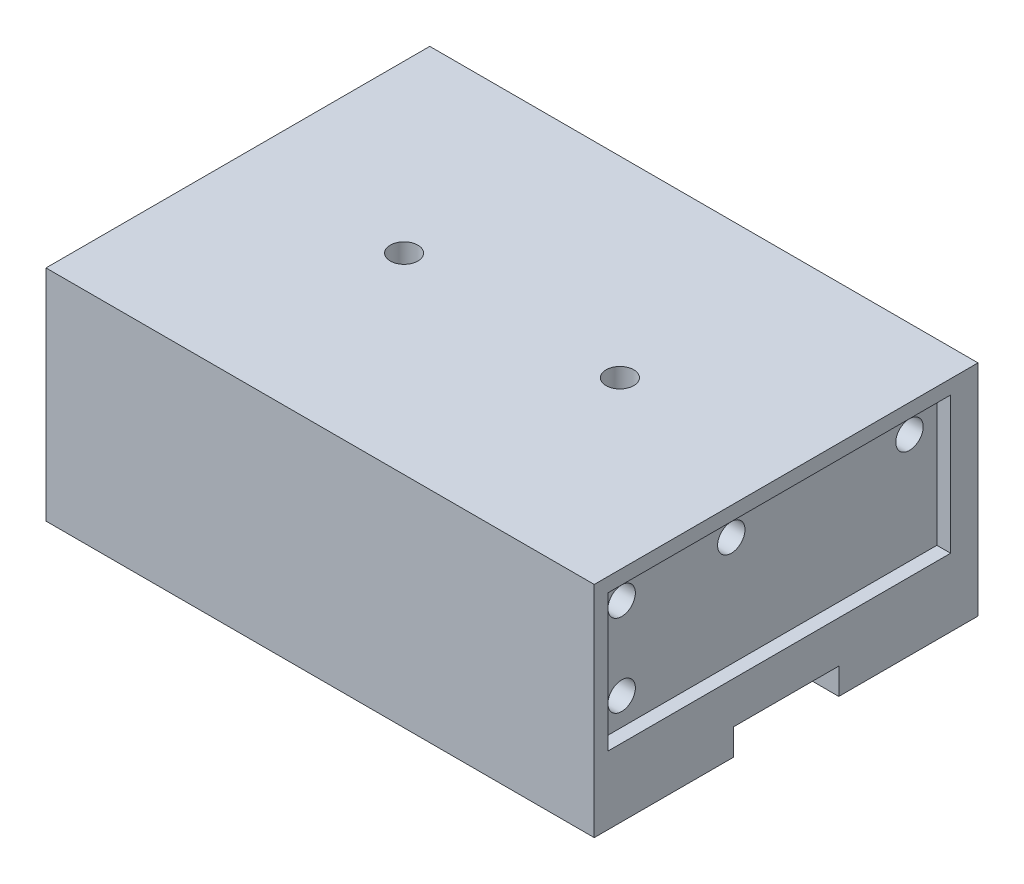
ISO-10303-21;
HEADER;
FILE_DESCRIPTION(('STEP AP214'),'2;1');
FILE_NAME('part.step','',(''),(''),'','','');
FILE_SCHEMA(('AUTOMOTIVE_DESIGN { 1 0 10303 214 1 1 1 1 }'));
ENDSEC;
DATA;
#1=APPLICATION_CONTEXT('core data for automotive mechanical design processes');
#2=APPLICATION_PROTOCOL_DEFINITION('international standard','automotive_design',2000,#1);
#3=PRODUCT_CONTEXT('',#1,'mechanical');
#4=PRODUCT('Part','Part','',(#3));
#5=PRODUCT_RELATED_PRODUCT_CATEGORY('part','',(#4));
#6=PRODUCT_DEFINITION_FORMATION('','',#4);
#7=PRODUCT_DEFINITION_CONTEXT('part definition',#1,'design');
#8=PRODUCT_DEFINITION('design','',#6,#7);
#9=PRODUCT_DEFINITION_SHAPE('','',#8);
#10=(LENGTH_UNIT() NAMED_UNIT(*) SI_UNIT(.MILLI.,.METRE.));
#11=(NAMED_UNIT(*) PLANE_ANGLE_UNIT() SI_UNIT($,.RADIAN.));
#12=(NAMED_UNIT(*) SI_UNIT($,.STERADIAN.) SOLID_ANGLE_UNIT());
#13=UNCERTAINTY_MEASURE_WITH_UNIT(LENGTH_MEASURE(1.E-05),#10,'distance_accuracy_value','');
#14=(GEOMETRIC_REPRESENTATION_CONTEXT(3) GLOBAL_UNCERTAINTY_ASSIGNED_CONTEXT((#13)) GLOBAL_UNIT_ASSIGNED_CONTEXT((#10,
#11,#12)) REPRESENTATION_CONTEXT('',''));
#15=CARTESIAN_POINT('',(0.,0.,0.));
#16=DIRECTION('',(0.,0.,1.));
#17=DIRECTION('',(1.,0.,0.));
#18=AXIS2_PLACEMENT_3D('',#15,#16,#17);
#19=CARTESIAN_POINT('',(0.,0.,0.));
#20=DIRECTION('',(0.,-1.,0.));
#21=DIRECTION('',(0.,0.,-1.));
#22=AXIS2_PLACEMENT_3D('',#19,#20,#21);
#23=PLANE('',#22);
#24=DIRECTION('',(-1.,0.,0.));
#25=VECTOR('',#24,1.);
#26=CARTESIAN_POINT('',(-31.75,0.,6.1));
#27=LINE('',#26,#25);
#28=CARTESIAN_POINT('',(31.75,0.,6.1));
#29=VERTEX_POINT('',#28);
#30=CARTESIAN_POINT('',(-31.75,0.,6.1));
#31=VERTEX_POINT('',#30);
#32=EDGE_CURVE('E229',#29,#31,#27,.T.);
#33=ORIENTED_EDGE('',*,*,#32,.F.);
#34=DIRECTION('',(0.,0.,-1.));
#35=VECTOR('',#34,1.);
#36=CARTESIAN_POINT('',(31.75,0.,22.225));
#37=LINE('',#36,#35);
#38=CARTESIAN_POINT('',(31.75,0.,22.225));
#39=VERTEX_POINT('',#38);
#40=EDGE_CURVE('E275',#39,#29,#37,.T.);
#41=ORIENTED_EDGE('',*,*,#40,.F.);
#42=DIRECTION('',(1.,0.,0.));
#43=VECTOR('',#42,1.);
#44=CARTESIAN_POINT('',(-31.75,0.,22.225));
#45=LINE('',#44,#43);
#46=CARTESIAN_POINT('',(-31.75,0.,22.225));
#47=VERTEX_POINT('',#46);
#48=EDGE_CURVE('E265',#47,#39,#45,.T.);
#49=ORIENTED_EDGE('',*,*,#48,.F.);
#50=DIRECTION('',(0.,0.,1.));
#51=VECTOR('',#50,1.);
#52=CARTESIAN_POINT('',(-31.75,0.,22.225));
#53=LINE('',#52,#51);
#54=EDGE_CURVE('E282',#31,#47,#53,.T.);
#55=ORIENTED_EDGE('',*,*,#54,.F.);
#56=EDGE_LOOP('',(#33,#41,#49,#55));
#57=FACE_BOUND('',#56,.T.);
#58=ADVANCED_FACE('F44',(#57),#23,.T.);
#59=CARTESIAN_POINT('',(31.75,25.4,22.225));
#60=DIRECTION('',(-1.,0.,0.));
#61=DIRECTION('',(0.,0.,1.));
#62=AXIS2_PLACEMENT_3D('',#59,#60,#61);
#63=PLANE('',#62);
#64=DIRECTION('',(0.,0.,-1.));
#65=VECTOR('',#64,1.);
#66=CARTESIAN_POINT('',(31.75,7.89096200252952,20.6375));
#67=LINE('',#66,#65);
#68=CARTESIAN_POINT('',(31.75,7.89096200252952,20.6375));
#69=VERTEX_POINT('',#68);
#70=CARTESIAN_POINT('',(31.75,7.89096200252952,-19.05));
#71=VERTEX_POINT('',#70);
#72=EDGE_CURVE('E173',#69,#71,#67,.T.);
#73=ORIENTED_EDGE('',*,*,#72,.F.);
#74=DIRECTION('',(0.,-1.,0.));
#75=VECTOR('',#74,1.);
#76=CARTESIAN_POINT('',(31.75,23.7659620025295,20.6375));
#77=LINE('',#76,#75);
#78=CARTESIAN_POINT('',(31.75,23.7659620025295,20.6375));
#79=VERTEX_POINT('',#78);
#80=EDGE_CURVE('E62',#79,#69,#77,.T.);
#81=ORIENTED_EDGE('',*,*,#80,.F.);
#82=DIRECTION('',(0.,0.,1.));
#83=VECTOR('',#82,1.);
#84=CARTESIAN_POINT('',(31.75,23.7659620025295,20.6375));
#85=LINE('',#84,#83);
#86=CARTESIAN_POINT('',(31.75,23.7659620025295,-19.05));
#87=VERTEX_POINT('',#86);
#88=EDGE_CURVE('E160',#87,#79,#85,.T.);
#89=ORIENTED_EDGE('',*,*,#88,.F.);
#90=DIRECTION('',(0.,1.,0.));
#91=VECTOR('',#90,1.);
#92=CARTESIAN_POINT('',(31.75,23.7659620025295,-19.05));
#93=LINE('',#92,#91);
#94=EDGE_CURVE('E164',#71,#87,#93,.T.);
#95=ORIENTED_EDGE('',*,*,#94,.F.);
#96=EDGE_LOOP('',(#73,#81,#89,#95));
#97=FACE_BOUND('',#96,.T.);
#98=ORIENTED_EDGE('',*,*,#40,.T.);
#99=DIRECTION('',(0.,-1.,0.));
#100=VECTOR('',#99,1.);
#101=CARTESIAN_POINT('',(31.75,3.048,6.1));
#102=LINE('',#101,#100);
#103=CARTESIAN_POINT('',(31.75,3.048,6.1));
#104=VERTEX_POINT('',#103);
#105=EDGE_CURVE('E251',#104,#29,#102,.T.);
#106=ORIENTED_EDGE('',*,*,#105,.F.);
#107=DIRECTION('',(0.,0.,1.));
#108=VECTOR('',#107,1.);
#109=CARTESIAN_POINT('',(31.75,3.048,6.1));
#110=LINE('',#109,#108);
#111=CARTESIAN_POINT('',(31.75,3.048,-6.1));
#112=VERTEX_POINT('',#111);
#113=EDGE_CURVE('E233',#112,#104,#110,.T.);
#114=ORIENTED_EDGE('',*,*,#113,.F.);
#115=DIRECTION('',(0.,-1.,0.));
#116=VECTOR('',#115,1.);
#117=CARTESIAN_POINT('',(31.75,3.048,-6.1));
#118=LINE('',#117,#116);
#119=CARTESIAN_POINT('',(31.75,0.,-6.1));
#120=VERTEX_POINT('',#119);
#121=EDGE_CURVE('E254',#112,#120,#118,.T.);
#122=ORIENTED_EDGE('',*,*,#121,.T.);
#123=CARTESIAN_POINT('',(31.75,0.,-22.225));
#124=VERTEX_POINT('',#123);
#125=EDGE_CURVE('E250',#120,#124,#37,.T.);
#126=ORIENTED_EDGE('',*,*,#125,.T.);
#127=DIRECTION('',(0.,-1.,0.));
#128=VECTOR('',#127,1.);
#129=CARTESIAN_POINT('',(31.75,25.4,-22.225));
#130=LINE('',#129,#128);
#131=CARTESIAN_POINT('',(31.75,25.4,-22.225));
#132=VERTEX_POINT('',#131);
#133=EDGE_CURVE('E11',#132,#124,#130,.T.);
#134=ORIENTED_EDGE('',*,*,#133,.F.);
#135=DIRECTION('',(0.,0.,-1.));
#136=VECTOR('',#135,1.);
#137=CARTESIAN_POINT('',(31.75,25.4,22.225));
#138=LINE('',#137,#136);
#139=CARTESIAN_POINT('',(31.75,25.4,22.225));
#140=VERTEX_POINT('',#139);
#141=EDGE_CURVE('E260',#140,#132,#138,.T.);
#142=ORIENTED_EDGE('',*,*,#141,.F.);
#143=DIRECTION('',(0.,-1.,0.));
#144=VECTOR('',#143,1.);
#145=CARTESIAN_POINT('',(31.75,25.4,22.225));
#146=LINE('',#145,#144);
#147=EDGE_CURVE('E274',#140,#39,#146,.T.);
#148=ORIENTED_EDGE('',*,*,#147,.T.);
#149=EDGE_LOOP('',(#98,#106,#114,#122,#126,#134,#142,#148));
#150=FACE_BOUND('',#149,.T.);
#151=ADVANCED_FACE('F46',(#97,#150),#63,.F.);
#152=CARTESIAN_POINT('',(-31.75,25.4,-22.225));
#153=DIRECTION('',(0.,0.,1.));
#154=DIRECTION('',(1.,0.,0.));
#155=AXIS2_PLACEMENT_3D('',#152,#153,#154);
#156=PLANE('',#155);
#157=DIRECTION('',(-1.,0.,0.));
#158=VECTOR('',#157,1.);
#159=CARTESIAN_POINT('',(-31.75,0.,-22.225));
#160=LINE('',#159,#158);
#161=CARTESIAN_POINT('',(-31.75,0.,-22.225));
#162=VERTEX_POINT('',#161);
#163=EDGE_CURVE('E279',#124,#162,#160,.T.);
#164=ORIENTED_EDGE('',*,*,#163,.T.);
#165=DIRECTION('',(0.,-1.,0.));
#166=VECTOR('',#165,1.);
#167=CARTESIAN_POINT('',(-31.75,25.4,-22.225));
#168=LINE('',#167,#166);
#169=CARTESIAN_POINT('',(-31.75,25.4,-22.225));
#170=VERTEX_POINT('',#169);
#171=EDGE_CURVE('E54',#170,#162,#168,.T.);
#172=ORIENTED_EDGE('',*,*,#171,.F.);
#173=DIRECTION('',(-1.,0.,0.));
#174=VECTOR('',#173,1.);
#175=CARTESIAN_POINT('',(-31.75,25.4,-22.225));
#176=LINE('',#175,#174);
#177=EDGE_CURVE('E264',#132,#170,#176,.T.);
#178=ORIENTED_EDGE('',*,*,#177,.F.);
#179=ORIENTED_EDGE('',*,*,#133,.T.);
#180=EDGE_LOOP('',(#164,#172,#178,#179));
#181=FACE_BOUND('',#180,.T.);
#182=ADVANCED_FACE('F349',(#181),#156,.F.);
#183=CARTESIAN_POINT('',(-31.75,25.4,22.225));
#184=DIRECTION('',(1.,0.,0.));
#185=DIRECTION('',(0.,0.,-1.));
#186=AXIS2_PLACEMENT_3D('',#183,#184,#185);
#187=PLANE('',#186);
#188=DIRECTION('',(0.,0.,-1.));
#189=VECTOR('',#188,1.);
#190=CARTESIAN_POINT('',(-31.75,3.048,6.1));
#191=LINE('',#190,#189);
#192=CARTESIAN_POINT('',(-31.75,3.048,6.1));
#193=VERTEX_POINT('',#192);
#194=CARTESIAN_POINT('',(-31.75,3.048,-6.1));
#195=VERTEX_POINT('',#194);
#196=EDGE_CURVE('E224',#193,#195,#191,.T.);
#197=ORIENTED_EDGE('',*,*,#196,.F.);
#198=DIRECTION('',(0.,-1.,0.));
#199=VECTOR('',#198,1.);
#200=CARTESIAN_POINT('',(-31.75,3.048,6.1));
#201=LINE('',#200,#199);
#202=EDGE_CURVE('E246',#193,#31,#201,.T.);
#203=ORIENTED_EDGE('',*,*,#202,.T.);
#204=ORIENTED_EDGE('',*,*,#54,.T.);
#205=DIRECTION('',(0.,-1.,0.));
#206=VECTOR('',#205,1.);
#207=CARTESIAN_POINT('',(-31.75,25.4,22.225));
#208=LINE('',#207,#206);
#209=CARTESIAN_POINT('',(-31.75,25.4,22.225));
#210=VERTEX_POINT('',#209);
#211=EDGE_CURVE('E292',#210,#47,#208,.T.);
#212=ORIENTED_EDGE('',*,*,#211,.F.);
#213=DIRECTION('',(0.,0.,1.));
#214=VECTOR('',#213,1.);
#215=CARTESIAN_POINT('',(-31.75,25.4,22.225));
#216=LINE('',#215,#214);
#217=EDGE_CURVE('E268',#170,#210,#216,.T.);
#218=ORIENTED_EDGE('',*,*,#217,.F.);
#219=ORIENTED_EDGE('',*,*,#171,.T.);
#220=CARTESIAN_POINT('',(-31.75,0.,-6.1));
#221=VERTEX_POINT('',#220);
#222=EDGE_CURVE('E283',#162,#221,#53,.T.);
#223=ORIENTED_EDGE('',*,*,#222,.T.);
#224=DIRECTION('',(0.,-1.,0.));
#225=VECTOR('',#224,1.);
#226=CARTESIAN_POINT('',(-31.75,3.048,-6.1));
#227=LINE('',#226,#225);
#228=EDGE_CURVE('E70',#195,#221,#227,.T.);
#229=ORIENTED_EDGE('',*,*,#228,.F.);
#230=EDGE_LOOP('',(#197,#203,#204,#212,#218,#219,#223,#229));
#231=FACE_BOUND('',#230,.T.);
#232=ADVANCED_FACE('F320',(#231),#187,.F.);
#233=CARTESIAN_POINT('',(-31.75,25.4,22.225));
#234=DIRECTION('',(0.,0.,-1.));
#235=DIRECTION('',(-1.,0.,0.));
#236=AXIS2_PLACEMENT_3D('',#233,#234,#235);
#237=PLANE('',#236);
#238=ORIENTED_EDGE('',*,*,#48,.T.);
#239=ORIENTED_EDGE('',*,*,#147,.F.);
#240=DIRECTION('',(1.,0.,0.));
#241=VECTOR('',#240,1.);
#242=CARTESIAN_POINT('',(-31.75,25.4,22.225));
#243=LINE('',#242,#241);
#244=EDGE_CURVE('E271',#210,#140,#243,.T.);
#245=ORIENTED_EDGE('',*,*,#244,.F.);
#246=ORIENTED_EDGE('',*,*,#211,.T.);
#247=EDGE_LOOP('',(#238,#239,#245,#246));
#248=FACE_BOUND('',#247,.T.);
#249=ADVANCED_FACE('F343',(#248),#237,.F.);
#250=CARTESIAN_POINT('',(0.,25.4,0.));
#251=DIRECTION('',(0.,-1.,0.));
#252=DIRECTION('',(0.,0.,-1.));
#253=AXIS2_PLACEMENT_3D('',#250,#251,#252);
#254=PLANE('',#253);
#255=CARTESIAN_POINT('',(-12.5,25.4,0.));
#256=DIRECTION('',(0.,1.,0.));
#257=DIRECTION('',(0.,0.,1.));
#258=AXIS2_PLACEMENT_3D('',#255,#256,#257);
#259=CIRCLE('',#258,1.6);
#260=CARTESIAN_POINT('',(-12.5,25.4,1.6));
#261=VERTEX_POINT('',#260);
#262=EDGE_CURVE('E216',#261,#261,#259,.T.);
#263=ORIENTED_EDGE('',*,*,#262,.F.);
#264=EDGE_LOOP('',(#263));
#265=FACE_BOUND('',#264,.T.);
#266=CARTESIAN_POINT('',(12.5,25.4,0.));
#267=DIRECTION('',(0.,1.,0.));
#268=DIRECTION('',(0.,0.,1.));
#269=AXIS2_PLACEMENT_3D('',#266,#267,#268);
#270=CIRCLE('',#269,1.6);
#271=CARTESIAN_POINT('',(12.5,25.4,1.6));
#272=VERTEX_POINT('',#271);
#273=EDGE_CURVE('E215',#272,#272,#270,.T.);
#274=ORIENTED_EDGE('',*,*,#273,.F.);
#275=EDGE_LOOP('',(#274));
#276=FACE_BOUND('',#275,.T.);
#277=ORIENTED_EDGE('',*,*,#141,.T.);
#278=ORIENTED_EDGE('',*,*,#177,.T.);
#279=ORIENTED_EDGE('',*,*,#217,.T.);
#280=ORIENTED_EDGE('',*,*,#244,.T.);
#281=EDGE_LOOP('',(#277,#278,#279,#280));
#282=FACE_BOUND('',#281,.T.);
#283=ADVANCED_FACE('F347',(#265,#276,#282),#254,.F.);
#284=DIRECTION('',(1.,0.,0.));
#285=VECTOR('',#284,1.);
#286=CARTESIAN_POINT('',(-31.75,0.,-6.1));
#287=LINE('',#286,#285);
#288=EDGE_CURVE('E240',#221,#120,#287,.T.);
#289=ORIENTED_EDGE('',*,*,#288,.F.);
#290=ORIENTED_EDGE('',*,*,#222,.F.);
#291=ORIENTED_EDGE('',*,*,#163,.F.);
#292=ORIENTED_EDGE('',*,*,#125,.F.);
#293=EDGE_LOOP('',(#289,#290,#291,#292));
#294=FACE_BOUND('',#293,.T.);
#295=ADVANCED_FACE('F326',(#294),#23,.T.);
#296=CARTESIAN_POINT('',(-31.75,3.048,6.1));
#297=DIRECTION('',(0.,0.,1.));
#298=DIRECTION('',(1.,0.,0.));
#299=AXIS2_PLACEMENT_3D('',#296,#297,#298);
#300=PLANE('',#299);
#301=ORIENTED_EDGE('',*,*,#32,.T.);
#302=ORIENTED_EDGE('',*,*,#202,.F.);
#303=DIRECTION('',(-1.,0.,0.));
#304=VECTOR('',#303,1.);
#305=CARTESIAN_POINT('',(-31.75,3.048,6.1));
#306=LINE('',#305,#304);
#307=EDGE_CURVE('E236',#104,#193,#306,.T.);
#308=ORIENTED_EDGE('',*,*,#307,.F.);
#309=ORIENTED_EDGE('',*,*,#105,.T.);
#310=EDGE_LOOP('',(#301,#302,#308,#309));
#311=FACE_BOUND('',#310,.T.);
#312=ADVANCED_FACE('F332',(#311),#300,.F.);
#313=CARTESIAN_POINT('',(-31.75,3.048,-6.1));
#314=DIRECTION('',(0.,0.,-1.));
#315=DIRECTION('',(-1.,0.,0.));
#316=AXIS2_PLACEMENT_3D('',#313,#314,#315);
#317=PLANE('',#316);
#318=ORIENTED_EDGE('',*,*,#288,.T.);
#319=ORIENTED_EDGE('',*,*,#121,.F.);
#320=DIRECTION('',(1.,0.,0.));
#321=VECTOR('',#320,1.);
#322=CARTESIAN_POINT('',(-31.75,3.048,-6.1));
#323=LINE('',#322,#321);
#324=EDGE_CURVE('E228',#195,#112,#323,.T.);
#325=ORIENTED_EDGE('',*,*,#324,.F.);
#326=ORIENTED_EDGE('',*,*,#228,.T.);
#327=EDGE_LOOP('',(#318,#319,#325,#326));
#328=FACE_BOUND('',#327,.T.);
#329=ADVANCED_FACE('F312',(#328),#317,.F.);
#330=CARTESIAN_POINT('',(0.,3.048,0.));
#331=DIRECTION('',(0.,-1.,0.));
#332=DIRECTION('',(0.,0.,-1.));
#333=AXIS2_PLACEMENT_3D('',#330,#331,#332);
#334=PLANE('',#333);
#335=CARTESIAN_POINT('',(-12.5,3.048,0.));
#336=DIRECTION('',(0.,-1.,0.));
#337=DIRECTION('',(0.,0.,-1.));
#338=AXIS2_PLACEMENT_3D('',#335,#336,#337);
#339=CIRCLE('',#338,1.6);
#340=CARTESIAN_POINT('',(-12.5,3.048,-1.6));
#341=VERTEX_POINT('',#340);
#342=EDGE_CURVE('E243',#341,#341,#339,.T.);
#343=ORIENTED_EDGE('',*,*,#342,.F.);
#344=EDGE_LOOP('',(#343));
#345=FACE_BOUND('',#344,.T.);
#346=CARTESIAN_POINT('',(12.5,3.048,0.));
#347=DIRECTION('',(0.,-1.,0.));
#348=DIRECTION('',(0.,0.,-1.));
#349=AXIS2_PLACEMENT_3D('',#346,#347,#348);
#350=CIRCLE('',#349,1.6);
#351=CARTESIAN_POINT('',(12.5,3.048,-1.6));
#352=VERTEX_POINT('',#351);
#353=EDGE_CURVE('E220',#352,#352,#350,.T.);
#354=ORIENTED_EDGE('',*,*,#353,.F.);
#355=EDGE_LOOP('',(#354));
#356=FACE_BOUND('',#355,.T.);
#357=ORIENTED_EDGE('',*,*,#196,.T.);
#358=ORIENTED_EDGE('',*,*,#324,.T.);
#359=ORIENTED_EDGE('',*,*,#113,.T.);
#360=ORIENTED_EDGE('',*,*,#307,.T.);
#361=EDGE_LOOP('',(#357,#358,#359,#360));
#362=FACE_BOUND('',#361,.T.);
#363=ADVANCED_FACE('F308',(#345,#356,#362),#334,.T.);
#364=CARTESIAN_POINT('',(12.5,0.,0.));
#365=DIRECTION('',(0.,1.,0.));
#366=DIRECTION('',(0.,0.,1.));
#367=AXIS2_PLACEMENT_3D('',#364,#365,#366);
#368=CYLINDRICAL_SURFACE('',#367,1.6);
#369=ORIENTED_EDGE('',*,*,#353,.T.);
#370=EDGE_LOOP('',(#369));
#371=FACE_BOUND('',#370,.T.);
#372=ORIENTED_EDGE('',*,*,#273,.T.);
#373=EDGE_LOOP('',(#372));
#374=FACE_BOUND('',#373,.T.);
#375=ADVANCED_FACE('F311',(#371,#374),#368,.F.);
#376=CARTESIAN_POINT('',(-12.5,0.,0.));
#377=DIRECTION('',(0.,1.,0.));
#378=DIRECTION('',(0.,0.,1.));
#379=AXIS2_PLACEMENT_3D('',#376,#377,#378);
#380=CYLINDRICAL_SURFACE('',#379,1.6);
#381=ORIENTED_EDGE('',*,*,#342,.T.);
#382=EDGE_LOOP('',(#381));
#383=FACE_BOUND('',#382,.T.);
#384=ORIENTED_EDGE('',*,*,#262,.T.);
#385=EDGE_LOOP('',(#384));
#386=FACE_BOUND('',#385,.T.);
#387=ADVANCED_FACE('F305',(#383,#386),#380,.F.);
#388=CARTESIAN_POINT('',(30.1625,0.,0.));
#389=DIRECTION('',(1.,0.,0.));
#390=DIRECTION('',(0.,0.,-1.));
#391=AXIS2_PLACEMENT_3D('',#388,#389,#390);
#392=PLANE('',#391);
#393=DIRECTION('',(0.,-1.,0.));
#394=VECTOR('',#393,1.);
#395=CARTESIAN_POINT('',(30.1625,23.7659620025295,20.6375));
#396=LINE('',#395,#394);
#397=CARTESIAN_POINT('',(30.1625,23.7659620025295,20.6375));
#398=VERTEX_POINT('',#397);
#399=CARTESIAN_POINT('',(30.1625,7.89096200252952,20.6375));
#400=VERTEX_POINT('',#399);
#401=EDGE_CURVE('E138',#398,#400,#396,.T.);
#402=ORIENTED_EDGE('',*,*,#401,.T.);
#403=DIRECTION('',(0.,0.,-1.));
#404=VECTOR('',#403,1.);
#405=CARTESIAN_POINT('',(30.1625,7.89096200252952,20.6375));
#406=LINE('',#405,#404);
#407=CARTESIAN_POINT('',(30.1625,7.89096200252952,-19.05));
#408=VERTEX_POINT('',#407);
#409=EDGE_CURVE('E148',#400,#408,#406,.T.);
#410=ORIENTED_EDGE('',*,*,#409,.T.);
#411=DIRECTION('',(0.,1.,0.));
#412=VECTOR('',#411,1.);
#413=CARTESIAN_POINT('',(30.1625,23.7659620025295,-19.05));
#414=LINE('',#413,#412);
#415=CARTESIAN_POINT('',(30.1625,23.7659620025295,-19.05));
#416=VERTEX_POINT('',#415);
#417=EDGE_CURVE('E154',#408,#416,#414,.T.);
#418=ORIENTED_EDGE('',*,*,#417,.T.);
#419=DIRECTION('',(0.,0.,1.));
#420=VECTOR('',#419,1.);
#421=CARTESIAN_POINT('',(30.1625,23.7659620025295,20.6375));
#422=LINE('',#421,#420);
#423=EDGE_CURVE('E145',#416,#398,#422,.T.);
#424=ORIENTED_EDGE('',*,*,#423,.T.);
#425=EDGE_LOOP('',(#402,#410,#418,#424));
#426=FACE_BOUND('',#425,.T.);
#427=CARTESIAN_POINT('',(30.1625,11.0659620025295,17.4625));
#428=DIRECTION('',(1.,0.,0.));
#429=DIRECTION('',(0.,0.,-1.));
#430=AXIS2_PLACEMENT_3D('',#427,#428,#429);
#431=CIRCLE('',#430,1.5875);
#432=CARTESIAN_POINT('',(30.1625,11.0659620025295,15.875));
#433=VERTEX_POINT('',#432);
#434=EDGE_CURVE('E48',#433,#433,#431,.F.);
#435=ORIENTED_EDGE('',*,*,#434,.T.);
#436=EDGE_LOOP('',(#435));
#437=FACE_BOUND('',#436,.T.);
#438=CARTESIAN_POINT('',(30.1625,20.5909620025295,17.4625));
#439=DIRECTION('',(1.,0.,0.));
#440=DIRECTION('',(0.,0.,-1.));
#441=AXIS2_PLACEMENT_3D('',#438,#439,#440);
#442=CIRCLE('',#441,1.5875);
#443=CARTESIAN_POINT('',(30.1625,20.5909620025295,15.875));
#444=VERTEX_POINT('',#443);
#445=EDGE_CURVE('E187',#444,#444,#442,.F.);
#446=ORIENTED_EDGE('',*,*,#445,.T.);
#447=EDGE_LOOP('',(#446));
#448=FACE_BOUND('',#447,.T.);
#449=CARTESIAN_POINT('',(30.1625,20.5909620025295,4.7625));
#450=DIRECTION('',(1.,0.,0.));
#451=DIRECTION('',(0.,0.,-1.));
#452=AXIS2_PLACEMENT_3D('',#449,#450,#451);
#453=CIRCLE('',#452,1.5875);
#454=CARTESIAN_POINT('',(30.1625,20.5909620025295,3.175));
#455=VERTEX_POINT('',#454);
#456=EDGE_CURVE('E191',#455,#455,#453,.F.);
#457=ORIENTED_EDGE('',*,*,#456,.T.);
#458=EDGE_LOOP('',(#457));
#459=FACE_BOUND('',#458,.T.);
#460=CARTESIAN_POINT('',(30.1625,20.5909620025295,-15.875));
#461=DIRECTION('',(1.,0.,0.));
#462=DIRECTION('',(0.,0.,-1.));
#463=AXIS2_PLACEMENT_3D('',#460,#461,#462);
#464=CIRCLE('',#463,1.5875);
#465=CARTESIAN_POINT('',(30.1625,20.5909620025295,-17.4625));
#466=VERTEX_POINT('',#465);
#467=EDGE_CURVE('E195',#466,#466,#464,.F.);
#468=ORIENTED_EDGE('',*,*,#467,.T.);
#469=EDGE_LOOP('',(#468));
#470=FACE_BOUND('',#469,.T.);
#471=ADVANCED_FACE('F156',(#426,#437,#448,#459,#470),#392,.T.);
#472=CARTESIAN_POINT('',(30.1625,23.7659620025295,20.6375));
#473=DIRECTION('',(0.,0.,1.));
#474=DIRECTION('',(0.,-1.,0.));
#475=AXIS2_PLACEMENT_3D('',#472,#473,#474);
#476=PLANE('',#475);
#477=ORIENTED_EDGE('',*,*,#80,.T.);
#478=DIRECTION('',(1.,0.,0.));
#479=VECTOR('',#478,1.);
#480=CARTESIAN_POINT('',(30.1625,7.89096200252952,20.6375));
#481=LINE('',#480,#479);
#482=EDGE_CURVE('E134',#400,#69,#481,.T.);
#483=ORIENTED_EDGE('',*,*,#482,.F.);
#484=ORIENTED_EDGE('',*,*,#401,.F.);
#485=DIRECTION('',(1.,0.,0.));
#486=VECTOR('',#485,1.);
#487=CARTESIAN_POINT('',(30.1625,23.7659620025295,20.6375));
#488=LINE('',#487,#486);
#489=EDGE_CURVE('E179',#398,#79,#488,.T.);
#490=ORIENTED_EDGE('',*,*,#489,.T.);
#491=EDGE_LOOP('',(#477,#483,#484,#490));
#492=FACE_BOUND('',#491,.T.);
#493=ADVANCED_FACE('F136',(#492),#476,.F.);
#494=CARTESIAN_POINT('',(30.1625,23.7659620025295,20.6375));
#495=DIRECTION('',(0.,1.,0.));
#496=DIRECTION('',(0.,0.,1.));
#497=AXIS2_PLACEMENT_3D('',#494,#495,#496);
#498=PLANE('',#497);
#499=ORIENTED_EDGE('',*,*,#88,.T.);
#500=ORIENTED_EDGE('',*,*,#489,.F.);
#501=ORIENTED_EDGE('',*,*,#423,.F.);
#502=DIRECTION('',(1.,0.,0.));
#503=VECTOR('',#502,1.);
#504=CARTESIAN_POINT('',(30.1625,23.7659620025295,-19.05));
#505=LINE('',#504,#503);
#506=EDGE_CURVE('E182',#416,#87,#505,.T.);
#507=ORIENTED_EDGE('',*,*,#506,.T.);
#508=EDGE_LOOP('',(#499,#500,#501,#507));
#509=FACE_BOUND('',#508,.T.);
#510=ADVANCED_FACE('F417',(#509),#498,.F.);
#511=CARTESIAN_POINT('',(30.1625,23.7659620025295,-19.05));
#512=DIRECTION('',(0.,0.,-1.));
#513=DIRECTION('',(0.,1.,0.));
#514=AXIS2_PLACEMENT_3D('',#511,#512,#513);
#515=PLANE('',#514);
#516=ORIENTED_EDGE('',*,*,#94,.T.);
#517=ORIENTED_EDGE('',*,*,#506,.F.);
#518=ORIENTED_EDGE('',*,*,#417,.F.);
#519=DIRECTION('',(1.,0.,0.));
#520=VECTOR('',#519,1.);
#521=CARTESIAN_POINT('',(30.1625,7.89096200252952,-19.05));
#522=LINE('',#521,#520);
#523=EDGE_CURVE('E144',#408,#71,#522,.T.);
#524=ORIENTED_EDGE('',*,*,#523,.T.);
#525=EDGE_LOOP('',(#516,#517,#518,#524));
#526=FACE_BOUND('',#525,.T.);
#527=ADVANCED_FACE('F420',(#526),#515,.F.);
#528=CARTESIAN_POINT('',(30.1625,7.89096200252952,20.6375));
#529=DIRECTION('',(0.,-1.,0.));
#530=DIRECTION('',(0.,0.,-1.));
#531=AXIS2_PLACEMENT_3D('',#528,#529,#530);
#532=PLANE('',#531);
#533=ORIENTED_EDGE('',*,*,#72,.T.);
#534=ORIENTED_EDGE('',*,*,#523,.F.);
#535=ORIENTED_EDGE('',*,*,#409,.F.);
#536=ORIENTED_EDGE('',*,*,#482,.T.);
#537=EDGE_LOOP('',(#533,#534,#535,#536));
#538=FACE_BOUND('',#537,.T.);
#539=ADVANCED_FACE('F149',(#538),#532,.F.);
#540=CARTESIAN_POINT('',(25.4,20.5909620025295,17.4625));
#541=DIRECTION('',(1.,0.,0.));
#542=DIRECTION('',(0.,0.,-1.));
#543=AXIS2_PLACEMENT_3D('',#540,#541,#542);
#544=PLANE('',#543);
#545=CARTESIAN_POINT('',(25.4,20.5909620025295,17.4625));
#546=DIRECTION('',(1.,0.,0.));
#547=DIRECTION('',(0.,0.,-1.));
#548=AXIS2_PLACEMENT_3D('',#545,#546,#547);
#549=CIRCLE('',#548,1.5875);
#550=CARTESIAN_POINT('',(25.4,20.5909620025295,15.875));
#551=VERTEX_POINT('',#550);
#552=EDGE_CURVE('E203',#551,#551,#549,.T.);
#553=ORIENTED_EDGE('',*,*,#552,.T.);
#554=EDGE_LOOP('',(#553));
#555=FACE_BOUND('',#554,.T.);
#556=ADVANCED_FACE('F403',(#555),#544,.T.);
#557=CARTESIAN_POINT('',(25.4,20.5909620025295,17.4625));
#558=DIRECTION('',(1.,0.,0.));
#559=DIRECTION('',(0.,0.,-1.));
#560=AXIS2_PLACEMENT_3D('',#557,#558,#559);
#561=CYLINDRICAL_SURFACE('',#560,1.5875);
#562=ORIENTED_EDGE('',*,*,#552,.F.);
#563=EDGE_LOOP('',(#562));
#564=FACE_BOUND('',#563,.T.);
#565=ORIENTED_EDGE('',*,*,#445,.F.);
#566=EDGE_LOOP('',(#565));
#567=FACE_BOUND('',#566,.T.);
#568=ADVANCED_FACE('F399',(#564,#567),#561,.F.);
#569=CARTESIAN_POINT('',(25.4,20.5909620025295,4.7625));
#570=DIRECTION('',(1.,0.,0.));
#571=DIRECTION('',(0.,0.,-1.));
#572=AXIS2_PLACEMENT_3D('',#569,#570,#571);
#573=PLANE('',#572);
#574=CARTESIAN_POINT('',(25.4,20.5909620025295,4.7625));
#575=DIRECTION('',(1.,0.,0.));
#576=DIRECTION('',(0.,0.,-1.));
#577=AXIS2_PLACEMENT_3D('',#574,#575,#576);
#578=CIRCLE('',#577,1.5875);
#579=CARTESIAN_POINT('',(25.4,20.5909620025295,3.175));
#580=VERTEX_POINT('',#579);
#581=EDGE_CURVE('E207',#580,#580,#578,.T.);
#582=ORIENTED_EDGE('',*,*,#581,.T.);
#583=EDGE_LOOP('',(#582));
#584=FACE_BOUND('',#583,.T.);
#585=ADVANCED_FACE('F395',(#584),#573,.T.);
#586=CARTESIAN_POINT('',(25.4,20.5909620025295,4.7625));
#587=DIRECTION('',(1.,0.,0.));
#588=DIRECTION('',(0.,0.,-1.));
#589=AXIS2_PLACEMENT_3D('',#586,#587,#588);
#590=CYLINDRICAL_SURFACE('',#589,1.5875);
#591=ORIENTED_EDGE('',*,*,#581,.F.);
#592=EDGE_LOOP('',(#591));
#593=FACE_BOUND('',#592,.T.);
#594=ORIENTED_EDGE('',*,*,#456,.F.);
#595=EDGE_LOOP('',(#594));
#596=FACE_BOUND('',#595,.T.);
#597=ADVANCED_FACE('F391',(#593,#596),#590,.F.);
#598=CARTESIAN_POINT('',(25.4,20.5909620025295,-15.875));
#599=DIRECTION('',(1.,0.,0.));
#600=DIRECTION('',(0.,0.,-1.));
#601=AXIS2_PLACEMENT_3D('',#598,#599,#600);
#602=PLANE('',#601);
#603=CARTESIAN_POINT('',(25.4,20.5909620025295,-15.875));
#604=DIRECTION('',(1.,0.,0.));
#605=DIRECTION('',(0.,0.,-1.));
#606=AXIS2_PLACEMENT_3D('',#603,#604,#605);
#607=CIRCLE('',#606,1.5875);
#608=CARTESIAN_POINT('',(25.4,20.5909620025295,-17.4625));
#609=VERTEX_POINT('',#608);
#610=EDGE_CURVE('E211',#609,#609,#607,.T.);
#611=ORIENTED_EDGE('',*,*,#610,.T.);
#612=EDGE_LOOP('',(#611));
#613=FACE_BOUND('',#612,.T.);
#614=ADVANCED_FACE('F387',(#613),#602,.T.);
#615=CARTESIAN_POINT('',(25.4,20.5909620025295,-15.875));
#616=DIRECTION('',(1.,0.,0.));
#617=DIRECTION('',(0.,0.,-1.));
#618=AXIS2_PLACEMENT_3D('',#615,#616,#617);
#619=CYLINDRICAL_SURFACE('',#618,1.5875);
#620=ORIENTED_EDGE('',*,*,#610,.F.);
#621=EDGE_LOOP('',(#620));
#622=FACE_BOUND('',#621,.T.);
#623=ORIENTED_EDGE('',*,*,#467,.F.);
#624=EDGE_LOOP('',(#623));
#625=FACE_BOUND('',#624,.T.);
#626=ADVANCED_FACE('F383',(#622,#625),#619,.F.);
#627=CARTESIAN_POINT('',(25.4,11.0659620025295,17.4625));
#628=DIRECTION('',(1.,0.,0.));
#629=DIRECTION('',(0.,0.,-1.));
#630=AXIS2_PLACEMENT_3D('',#627,#628,#629);
#631=PLANE('',#630);
#632=CARTESIAN_POINT('',(25.4,11.0659620025295,17.4625));
#633=DIRECTION('',(1.,0.,0.));
#634=DIRECTION('',(0.,0.,-1.));
#635=AXIS2_PLACEMENT_3D('',#632,#633,#634);
#636=CIRCLE('',#635,1.5875);
#637=CARTESIAN_POINT('',(25.4,11.0659620025295,15.875));
#638=VERTEX_POINT('',#637);
#639=EDGE_CURVE('E199',#638,#638,#636,.T.);
#640=ORIENTED_EDGE('',*,*,#639,.T.);
#641=EDGE_LOOP('',(#640));
#642=FACE_BOUND('',#641,.T.);
#643=ADVANCED_FACE('F386',(#642),#631,.T.);
#644=CARTESIAN_POINT('',(25.4,11.0659620025295,17.4625));
#645=DIRECTION('',(1.,0.,0.));
#646=DIRECTION('',(0.,0.,-1.));
#647=AXIS2_PLACEMENT_3D('',#644,#645,#646);
#648=CYLINDRICAL_SURFACE('',#647,1.5875);
#649=ORIENTED_EDGE('',*,*,#639,.F.);
#650=EDGE_LOOP('',(#649));
#651=FACE_BOUND('',#650,.T.);
#652=ORIENTED_EDGE('',*,*,#434,.F.);
#653=EDGE_LOOP('',(#652));
#654=FACE_BOUND('',#653,.T.);
#655=ADVANCED_FACE('F408',(#651,#654),#648,.F.);
#656=CLOSED_SHELL('',(#58,#151,#182,#232,#249,#283,#295,#312,#329,#363,#375,#387,#471,#493,#510,
#527,#539,#556,#568,#585,#597,#614,#626,#643,#655));
#657=MANIFOLD_SOLID_BREP('B2',#656);
#658=ADVANCED_BREP_SHAPE_REPRESENTATION('',(#18,#657),#14);
#659=SHAPE_DEFINITION_REPRESENTATION(#9,#658);
ENDSEC;
END-ISO-10303-21;
